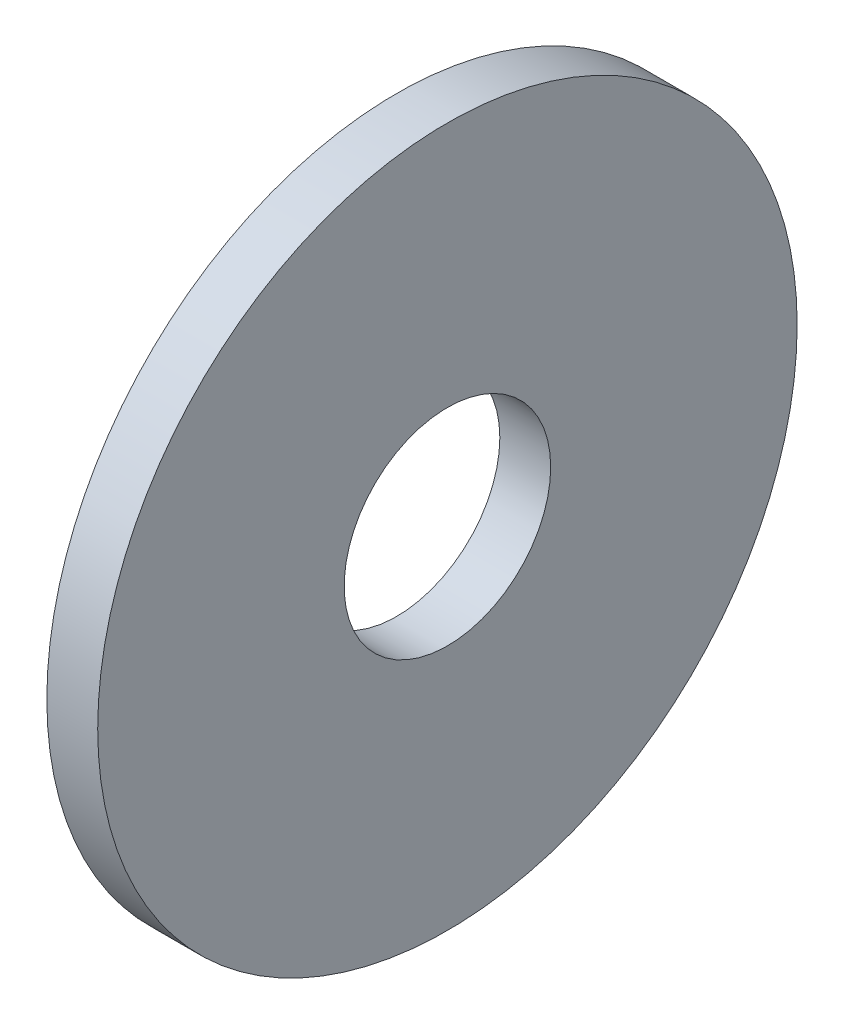
ISO-10303-21;
HEADER;
FILE_DESCRIPTION(('STEP AP214'),'2;1');
FILE_NAME('part.step','',(''),(''),'','','');
FILE_SCHEMA(('AUTOMOTIVE_DESIGN { 1 0 10303 214 1 1 1 1 }'));
ENDSEC;
DATA;
#1=APPLICATION_CONTEXT('core data for automotive mechanical design processes');
#2=APPLICATION_PROTOCOL_DEFINITION('international standard','automotive_design',2000,#1);
#3=PRODUCT_CONTEXT('',#1,'mechanical');
#4=PRODUCT('Part','Part','',(#3));
#5=PRODUCT_RELATED_PRODUCT_CATEGORY('part','',(#4));
#6=PRODUCT_DEFINITION_FORMATION('','',#4);
#7=PRODUCT_DEFINITION_CONTEXT('part definition',#1,'design');
#8=PRODUCT_DEFINITION('design','',#6,#7);
#9=PRODUCT_DEFINITION_SHAPE('','',#8);
#10=(LENGTH_UNIT() NAMED_UNIT(*) SI_UNIT(.MILLI.,.METRE.));
#11=(NAMED_UNIT(*) PLANE_ANGLE_UNIT() SI_UNIT($,.RADIAN.));
#12=(NAMED_UNIT(*) SI_UNIT($,.STERADIAN.) SOLID_ANGLE_UNIT());
#13=UNCERTAINTY_MEASURE_WITH_UNIT(LENGTH_MEASURE(1.E-05),#10,'distance_accuracy_value','');
#14=(GEOMETRIC_REPRESENTATION_CONTEXT(3) GLOBAL_UNCERTAINTY_ASSIGNED_CONTEXT((#13)) GLOBAL_UNIT_ASSIGNED_CONTEXT((#10,
#11,#12)) REPRESENTATION_CONTEXT('',''));
#15=CARTESIAN_POINT('',(0.,0.,0.));
#16=DIRECTION('',(0.,0.,1.));
#17=DIRECTION('',(1.,0.,0.));
#18=AXIS2_PLACEMENT_3D('',#15,#16,#17);
#19=CARTESIAN_POINT('',(1.27,0.,0.));
#20=DIRECTION('',(1.,0.,0.));
#21=DIRECTION('',(0.,0.,-1.));
#22=AXIS2_PLACEMENT_3D('',#19,#20,#21);
#23=PLANE('',#22);
#24=CARTESIAN_POINT('',(1.27,0.,0.));
#25=DIRECTION('',(1.,0.,0.));
#26=DIRECTION('',(0.,0.,-1.));
#27=AXIS2_PLACEMENT_3D('',#24,#25,#26);
#28=CIRCLE('',#27,8.73125);
#29=CARTESIAN_POINT('',(1.27,0.,-8.73125));
#30=VERTEX_POINT('',#29);
#31=EDGE_CURVE('E10',#30,#30,#28,.T.);
#32=ORIENTED_EDGE('',*,*,#31,.T.);
#33=EDGE_LOOP('',(#32));
#34=FACE_BOUND('',#33,.T.);
#35=CARTESIAN_POINT('',(1.27,0.,0.));
#36=DIRECTION('',(1.,0.,0.));
#37=DIRECTION('',(0.,0.,-1.));
#38=AXIS2_PLACEMENT_3D('',#35,#36,#37);
#39=CIRCLE('',#38,2.5781);
#40=CARTESIAN_POINT('',(1.27,0.,-2.5781));
#41=VERTEX_POINT('',#40);
#42=EDGE_CURVE('E41',#41,#41,#39,.T.);
#43=ORIENTED_EDGE('',*,*,#42,.F.);
#44=EDGE_LOOP('',(#43));
#45=FACE_BOUND('',#44,.T.);
#46=ADVANCED_FACE('F30',(#34,#45),#23,.T.);
#47=CARTESIAN_POINT('',(0.,0.,0.));
#48=DIRECTION('',(1.,0.,0.));
#49=DIRECTION('',(0.,0.,-1.));
#50=AXIS2_PLACEMENT_3D('',#47,#48,#49);
#51=PLANE('',#50);
#52=CARTESIAN_POINT('',(0.,0.,0.));
#53=DIRECTION('',(1.,0.,0.));
#54=DIRECTION('',(0.,0.,-1.));
#55=AXIS2_PLACEMENT_3D('',#52,#53,#54);
#56=CIRCLE('',#55,8.73125);
#57=CARTESIAN_POINT('',(0.,0.,-8.73125));
#58=VERTEX_POINT('',#57);
#59=EDGE_CURVE('E34',#58,#58,#56,.T.);
#60=ORIENTED_EDGE('',*,*,#59,.F.);
#61=EDGE_LOOP('',(#60));
#62=FACE_BOUND('',#61,.T.);
#63=CARTESIAN_POINT('',(0.,0.,0.));
#64=DIRECTION('',(1.,0.,0.));
#65=DIRECTION('',(0.,0.,-1.));
#66=AXIS2_PLACEMENT_3D('',#63,#64,#65);
#67=CIRCLE('',#66,2.5781);
#68=CARTESIAN_POINT('',(0.,0.,-2.5781));
#69=VERTEX_POINT('',#68);
#70=EDGE_CURVE('E43',#69,#69,#67,.T.);
#71=ORIENTED_EDGE('',*,*,#70,.T.);
#72=EDGE_LOOP('',(#71));
#73=FACE_BOUND('',#72,.T.);
#74=ADVANCED_FACE('F53',(#62,#73),#51,.F.);
#75=CARTESIAN_POINT('',(1.27,0.,0.));
#76=DIRECTION('',(-1.,0.,0.));
#77=DIRECTION('',(0.,0.,1.));
#78=AXIS2_PLACEMENT_3D('',#75,#76,#77);
#79=CYLINDRICAL_SURFACE('',#78,8.73125);
#80=ORIENTED_EDGE('',*,*,#31,.F.);
#81=EDGE_LOOP('',(#80));
#82=FACE_BOUND('',#81,.T.);
#83=ORIENTED_EDGE('',*,*,#59,.T.);
#84=EDGE_LOOP('',(#83));
#85=FACE_BOUND('',#84,.T.);
#86=ADVANCED_FACE('F32',(#82,#85),#79,.T.);
#87=CARTESIAN_POINT('',(1.27,0.,0.));
#88=DIRECTION('',(-1.,0.,0.));
#89=DIRECTION('',(0.,0.,1.));
#90=AXIS2_PLACEMENT_3D('',#87,#88,#89);
#91=CYLINDRICAL_SURFACE('',#90,2.5781);
#92=ORIENTED_EDGE('',*,*,#42,.T.);
#93=EDGE_LOOP('',(#92));
#94=FACE_BOUND('',#93,.T.);
#95=ORIENTED_EDGE('',*,*,#70,.F.);
#96=EDGE_LOOP('',(#95));
#97=FACE_BOUND('',#96,.T.);
#98=ADVANCED_FACE('F49',(#94,#97),#91,.F.);
#99=CLOSED_SHELL('',(#46,#74,#86,#98));
#100=MANIFOLD_SOLID_BREP('B2',#99);
#101=ADVANCED_BREP_SHAPE_REPRESENTATION('',(#18,#100),#14);
#102=SHAPE_DEFINITION_REPRESENTATION(#9,#101);
ENDSEC;
END-ISO-10303-21;
